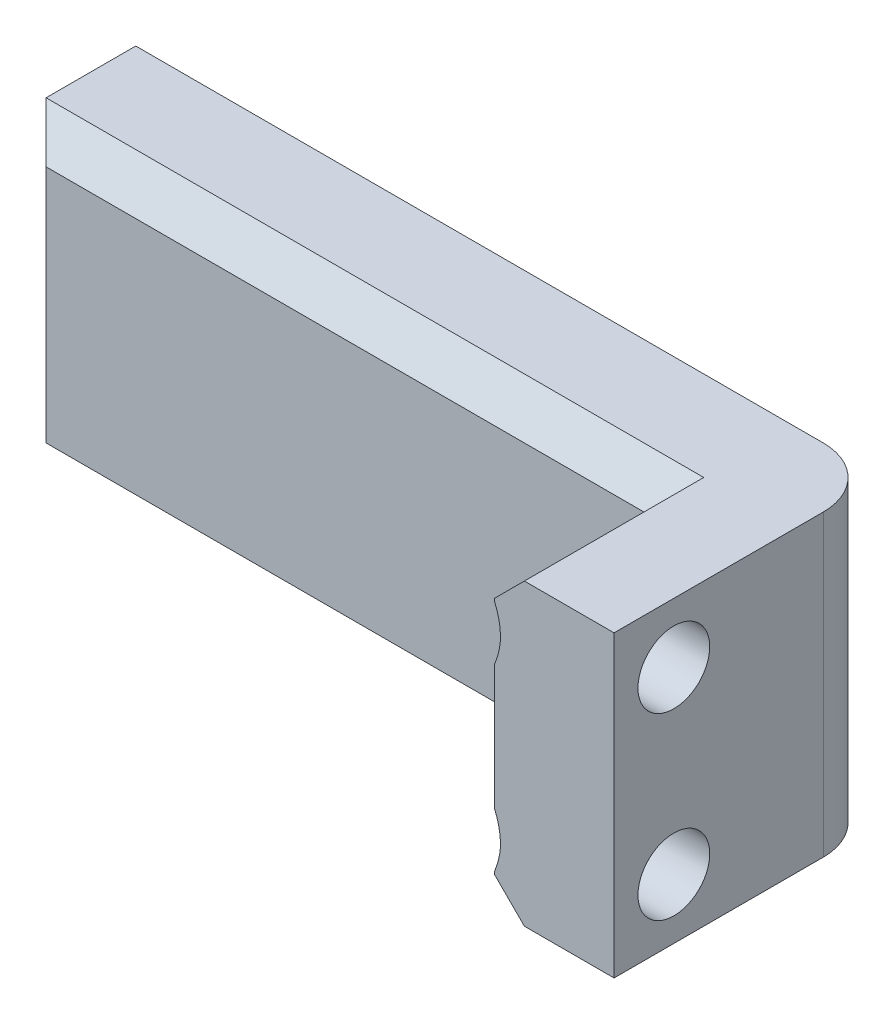
ISO-10303-21;
HEADER;
FILE_DESCRIPTION(('STEP AP214'),'2;1');
FILE_NAME('part.step','',(''),(''),'','','');
FILE_SCHEMA(('AUTOMOTIVE_DESIGN { 1 0 10303 214 1 1 1 1 }'));
ENDSEC;
DATA;
#1=APPLICATION_CONTEXT('core data for automotive mechanical design processes');
#2=APPLICATION_PROTOCOL_DEFINITION('international standard','automotive_design',2000,#1);
#3=PRODUCT_CONTEXT('',#1,'mechanical');
#4=PRODUCT('Part','Part','',(#3));
#5=PRODUCT_RELATED_PRODUCT_CATEGORY('part','',(#4));
#6=PRODUCT_DEFINITION_FORMATION('','',#4);
#7=PRODUCT_DEFINITION_CONTEXT('part definition',#1,'design');
#8=PRODUCT_DEFINITION('design','',#6,#7);
#9=PRODUCT_DEFINITION_SHAPE('','',#8);
#10=(LENGTH_UNIT() NAMED_UNIT(*) SI_UNIT(.MILLI.,.METRE.));
#11=(NAMED_UNIT(*) PLANE_ANGLE_UNIT() SI_UNIT($,.RADIAN.));
#12=(NAMED_UNIT(*) SI_UNIT($,.STERADIAN.) SOLID_ANGLE_UNIT());
#13=UNCERTAINTY_MEASURE_WITH_UNIT(LENGTH_MEASURE(1.E-05),#10,'distance_accuracy_value','');
#14=(GEOMETRIC_REPRESENTATION_CONTEXT(3) GLOBAL_UNCERTAINTY_ASSIGNED_CONTEXT((#13)) GLOBAL_UNIT_ASSIGNED_CONTEXT((#10,
#11,#12)) REPRESENTATION_CONTEXT('',''));
#15=CARTESIAN_POINT('',(0.,0.,0.));
#16=DIRECTION('',(0.,0.,1.));
#17=DIRECTION('',(1.,0.,0.));
#18=AXIS2_PLACEMENT_3D('',#15,#16,#17);
#19=CARTESIAN_POINT('',(21.,14.,9.));
#20=DIRECTION('',(1.,0.,0.));
#21=DIRECTION('',(0.,1.,0.));
#22=AXIS2_PLACEMENT_3D('',#19,#20,#21);
#23=PLANE('',#22);
#24=DIRECTION('',(0.,-1.,0.));
#25=VECTOR('',#24,1.);
#26=CARTESIAN_POINT('',(21.,14.,9.));
#27=LINE('',#26,#25);
#28=CARTESIAN_POINT('',(21.,11.,9.));
#29=VERTEX_POINT('',#28);
#30=CARTESIAN_POINT('',(21.,10.9165151389912,9.));
#31=VERTEX_POINT('',#30);
#32=EDGE_CURVE('E146',#29,#31,#27,.T.);
#33=ORIENTED_EDGE('',*,*,#32,.F.);
#34=DIRECTION('',(0.,0.,1.));
#35=VECTOR('',#34,1.);
#36=CARTESIAN_POINT('',(21.,11.,9.));
#37=LINE('',#36,#35);
#38=CARTESIAN_POINT('',(21.,11.,8.95959179422654));
#39=VERTEX_POINT('',#38);
#40=EDGE_CURVE('E174',#29,#39,#37,.F.);
#41=ORIENTED_EDGE('',*,*,#40,.T.);
#42=CARTESIAN_POINT('',(21.,10.,7.));
#43=DIRECTION('',(-1.,0.,0.));
#44=DIRECTION('',(0.,0.,1.));
#45=AXIS2_PLACEMENT_3D('',#42,#43,#44);
#46=CIRCLE('',#45,2.2);
#47=EDGE_CURVE('E166',#31,#39,#46,.T.);
#48=ORIENTED_EDGE('',*,*,#47,.F.);
#49=EDGE_LOOP('',(#33,#41,#48));
#50=FACE_BOUND('',#49,.T.);
#51=ADVANCED_FACE('F41',(#50),#23,.F.);
#52=DIRECTION('',(0.,-1.,0.));
#53=VECTOR('',#52,1.);
#54=CARTESIAN_POINT('',(21.,14.,4.));
#55=LINE('',#54,#53);
#56=CARTESIAN_POINT('',(21.,11.,4.));
#57=VERTEX_POINT('',#56);
#58=CARTESIAN_POINT('',(21.,3.,4.));
#59=VERTEX_POINT('',#58);
#60=EDGE_CURVE('E385',#57,#59,#55,.T.);
#61=ORIENTED_EDGE('',*,*,#60,.T.);
#62=DIRECTION('',(0.,0.,1.));
#63=VECTOR('',#62,1.);
#64=CARTESIAN_POINT('',(21.,3.,9.));
#65=LINE('',#64,#63);
#66=CARTESIAN_POINT('',(21.,3.00000000000001,5.04040820577346));
#67=VERTEX_POINT('',#66);
#68=EDGE_CURVE('E304',#59,#67,#65,.T.);
#69=ORIENTED_EDGE('',*,*,#68,.T.);
#70=CARTESIAN_POINT('',(21.,4.,7.));
#71=DIRECTION('',(-1.,0.,0.));
#72=DIRECTION('',(0.,0.,1.));
#73=AXIS2_PLACEMENT_3D('',#70,#71,#72);
#74=CIRCLE('',#73,2.2);
#75=CARTESIAN_POINT('',(21.,4.91651513899117,9.));
#76=VERTEX_POINT('',#75);
#77=EDGE_CURVE('E184',#76,#67,#74,.T.);
#78=ORIENTED_EDGE('',*,*,#77,.F.);
#79=CARTESIAN_POINT('',(21.,9.08348486100882,9.));
#80=VERTEX_POINT('',#79);
#81=EDGE_CURVE('E160',#80,#76,#27,.T.);
#82=ORIENTED_EDGE('',*,*,#81,.F.);
#83=CARTESIAN_POINT('',(21.,11.,5.04040820577346));
#84=VERTEX_POINT('',#83);
#85=EDGE_CURVE('E169',#84,#80,#46,.T.);
#86=ORIENTED_EDGE('',*,*,#85,.F.);
#87=DIRECTION('',(0.,0.,-1.));
#88=VECTOR('',#87,1.);
#89=CARTESIAN_POINT('',(21.,11.,9.));
#90=LINE('',#89,#88);
#91=EDGE_CURVE('E273',#84,#57,#90,.T.);
#92=ORIENTED_EDGE('',*,*,#91,.T.);
#93=EDGE_LOOP('',(#61,#69,#78,#82,#86,#92));
#94=FACE_BOUND('',#93,.T.);
#95=ADVANCED_FACE('F217',(#94),#23,.F.);
#96=CARTESIAN_POINT('',(21.,3.00000000000001,8.95959179422655));
#97=VERTEX_POINT('',#96);
#98=CARTESIAN_POINT('',(21.,3.08348486100883,9.));
#99=VERTEX_POINT('',#98);
#100=EDGE_CURVE('E189',#97,#99,#74,.T.);
#101=ORIENTED_EDGE('',*,*,#100,.F.);
#102=DIRECTION('',(0.,0.,-1.));
#103=VECTOR('',#102,1.);
#104=CARTESIAN_POINT('',(21.,3.,9.));
#105=LINE('',#104,#103);
#106=CARTESIAN_POINT('',(21.,3.,9.));
#107=VERTEX_POINT('',#106);
#108=EDGE_CURVE('E293',#97,#107,#105,.F.);
#109=ORIENTED_EDGE('',*,*,#108,.T.);
#110=EDGE_CURVE('E162',#99,#107,#27,.T.);
#111=ORIENTED_EDGE('',*,*,#110,.F.);
#112=EDGE_LOOP('',(#101,#109,#111));
#113=FACE_BOUND('',#112,.T.);
#114=ADVANCED_FACE('F336',(#113),#23,.F.);
#115=CARTESIAN_POINT('',(25.,0.,4.));
#116=DIRECTION('',(-1.,0.,0.));
#117=DIRECTION('',(0.,0.,1.));
#118=AXIS2_PLACEMENT_3D('',#115,#116,#117);
#119=PLANE('',#118);
#120=CARTESIAN_POINT('',(25.,10.,7.));
#121=DIRECTION('',(-1.,0.,0.));
#122=DIRECTION('',(0.,0.,1.));
#123=AXIS2_PLACEMENT_3D('',#120,#121,#122);
#124=CIRCLE('',#123,1.2);
#125=CARTESIAN_POINT('',(25.,10.,8.2));
#126=VERTEX_POINT('',#125);
#127=EDGE_CURVE('E181',#126,#126,#124,.T.);
#128=ORIENTED_EDGE('',*,*,#127,.T.);
#129=EDGE_LOOP('',(#128));
#130=FACE_BOUND('',#129,.T.);
#131=CARTESIAN_POINT('',(25.,4.,7.));
#132=DIRECTION('',(-1.,0.,0.));
#133=DIRECTION('',(0.,0.,1.));
#134=AXIS2_PLACEMENT_3D('',#131,#132,#133);
#135=CIRCLE('',#134,1.2);
#136=CARTESIAN_POINT('',(25.,4.,8.2));
#137=VERTEX_POINT('',#136);
#138=EDGE_CURVE('E203',#137,#137,#135,.T.);
#139=ORIENTED_EDGE('',*,*,#138,.T.);
#140=EDGE_LOOP('',(#139));
#141=FACE_BOUND('',#140,.T.);
#142=DIRECTION('',(0.,0.,1.));
#143=VECTOR('',#142,1.);
#144=CARTESIAN_POINT('',(25.,2.,0.));
#145=LINE('',#144,#143);
#146=CARTESIAN_POINT('',(25.,2.,2.));
#147=VERTEX_POINT('',#146);
#148=CARTESIAN_POINT('',(25.,2.,9.));
#149=VERTEX_POINT('',#148);
#150=EDGE_CURVE('E367',#147,#149,#145,.T.);
#151=ORIENTED_EDGE('',*,*,#150,.F.);
#152=DIRECTION('',(0.,1.,0.));
#153=VECTOR('',#152,1.);
#154=CARTESIAN_POINT('',(25.,0.,2.));
#155=LINE('',#154,#153);
#156=CARTESIAN_POINT('',(25.,12.,2.));
#157=VERTEX_POINT('',#156);
#158=EDGE_CURVE('E171',#147,#157,#155,.T.);
#159=ORIENTED_EDGE('',*,*,#158,.T.);
#160=DIRECTION('',(0.,0.,1.));
#161=VECTOR('',#160,1.);
#162=CARTESIAN_POINT('',(25.,12.,0.));
#163=LINE('',#162,#161);
#164=CARTESIAN_POINT('',(25.,12.,9.));
#165=VERTEX_POINT('',#164);
#166=EDGE_CURVE('E390',#157,#165,#163,.T.);
#167=ORIENTED_EDGE('',*,*,#166,.T.);
#168=DIRECTION('',(0.,1.,0.));
#169=VECTOR('',#168,1.);
#170=CARTESIAN_POINT('',(25.,14.,9.));
#171=LINE('',#170,#169);
#172=EDGE_CURVE('E383',#149,#165,#171,.T.);
#173=ORIENTED_EDGE('',*,*,#172,.F.);
#174=EDGE_LOOP('',(#151,#159,#167,#173));
#175=FACE_BOUND('',#174,.T.);
#176=ADVANCED_FACE('F342',(#130,#141,#175),#119,.F.);
#177=CARTESIAN_POINT('',(0.,0.,4.));
#178=DIRECTION('',(-1.,0.,0.));
#179=DIRECTION('',(0.,0.,1.));
#180=AXIS2_PLACEMENT_3D('',#177,#178,#179);
#181=PLANE('',#180);
#182=DIRECTION('',(0.,0.,1.));
#183=VECTOR('',#182,1.);
#184=CARTESIAN_POINT('',(0.,2.,0.));
#185=LINE('',#184,#183);
#186=CARTESIAN_POINT('',(0.,2.,0.));
#187=VERTEX_POINT('',#186);
#188=CARTESIAN_POINT('',(0.,2.,3.));
#189=VERTEX_POINT('',#188);
#190=EDGE_CURVE('E377',#187,#189,#185,.T.);
#191=ORIENTED_EDGE('',*,*,#190,.T.);
#192=DIRECTION('',(0.,1.,0.));
#193=VECTOR('',#192,1.);
#194=CARTESIAN_POINT('',(0.,0.,3.));
#195=LINE('',#194,#193);
#196=CARTESIAN_POINT('',(0.,12.,3.));
#197=VERTEX_POINT('',#196);
#198=EDGE_CURVE('E11',#189,#197,#195,.T.);
#199=ORIENTED_EDGE('',*,*,#198,.T.);
#200=DIRECTION('',(0.,0.,1.));
#201=VECTOR('',#200,1.);
#202=CARTESIAN_POINT('',(0.,12.,0.));
#203=LINE('',#202,#201);
#204=CARTESIAN_POINT('',(0.,12.,0.));
#205=VERTEX_POINT('',#204);
#206=EDGE_CURVE('E401',#205,#197,#203,.T.);
#207=ORIENTED_EDGE('',*,*,#206,.F.);
#208=DIRECTION('',(0.,1.,0.));
#209=VECTOR('',#208,1.);
#210=CARTESIAN_POINT('',(0.,0.,0.));
#211=LINE('',#210,#209);
#212=EDGE_CURVE('E159',#187,#205,#211,.T.);
#213=ORIENTED_EDGE('',*,*,#212,.F.);
#214=EDGE_LOOP('',(#191,#199,#207,#213));
#215=FACE_BOUND('',#214,.T.);
#216=ADVANCED_FACE('F347',(#215),#181,.T.);
#217=CARTESIAN_POINT('',(0.,0.,4.));
#218=DIRECTION('',(0.,0.,1.));
#219=DIRECTION('',(1.,0.,0.));
#220=AXIS2_PLACEMENT_3D('',#217,#218,#219);
#221=PLANE('',#220);
#222=DIRECTION('',(0.,-1.,0.));
#223=VECTOR('',#222,1.);
#224=CARTESIAN_POINT('',(1.,0.,4.));
#225=LINE('',#224,#223);
#226=CARTESIAN_POINT('',(1.,11.,4.));
#227=VERTEX_POINT('',#226);
#228=CARTESIAN_POINT('',(1.,3.,4.));
#229=VERTEX_POINT('',#228);
#230=EDGE_CURVE('E61',#227,#229,#225,.T.);
#231=ORIENTED_EDGE('',*,*,#230,.T.);
#232=DIRECTION('',(1.,0.,0.));
#233=VECTOR('',#232,1.);
#234=CARTESIAN_POINT('',(21.,3.,4.));
#235=LINE('',#234,#233);
#236=EDGE_CURVE('E53',#229,#59,#235,.T.);
#237=ORIENTED_EDGE('',*,*,#236,.T.);
#238=ORIENTED_EDGE('',*,*,#60,.F.);
#239=DIRECTION('',(-1.,0.,0.));
#240=VECTOR('',#239,1.);
#241=CARTESIAN_POINT('',(0.,11.,4.));
#242=LINE('',#241,#240);
#243=EDGE_CURVE('E66',#57,#227,#242,.T.);
#244=ORIENTED_EDGE('',*,*,#243,.T.);
#245=EDGE_LOOP('',(#231,#237,#238,#244));
#246=FACE_BOUND('',#245,.T.);
#247=ADVANCED_FACE('F460',(#246),#221,.T.);
#248=CARTESIAN_POINT('',(0.,0.,0.));
#249=DIRECTION('',(0.,0.,1.));
#250=DIRECTION('',(1.,0.,0.));
#251=AXIS2_PLACEMENT_3D('',#248,#249,#250);
#252=PLANE('',#251);
#253=DIRECTION('',(1.,0.,0.));
#254=VECTOR('',#253,1.);
#255=CARTESIAN_POINT('',(25.,12.,0.));
#256=LINE('',#255,#254);
#257=CARTESIAN_POINT('',(23.,12.,0.));
#258=VERTEX_POINT('',#257);
#259=EDGE_CURVE('E204',#205,#258,#256,.T.);
#260=ORIENTED_EDGE('',*,*,#259,.T.);
#261=DIRECTION('',(0.,1.,0.));
#262=VECTOR('',#261,1.);
#263=CARTESIAN_POINT('',(23.,0.,0.));
#264=LINE('',#263,#262);
#265=CARTESIAN_POINT('',(23.,2.,0.));
#266=VERTEX_POINT('',#265);
#267=EDGE_CURVE('E408',#258,#266,#264,.F.);
#268=ORIENTED_EDGE('',*,*,#267,.T.);
#269=DIRECTION('',(-1.,0.,0.));
#270=VECTOR('',#269,1.);
#271=CARTESIAN_POINT('',(0.,2.,0.));
#272=LINE('',#271,#270);
#273=EDGE_CURVE('E369',#266,#187,#272,.T.);
#274=ORIENTED_EDGE('',*,*,#273,.T.);
#275=ORIENTED_EDGE('',*,*,#212,.T.);
#276=EDGE_LOOP('',(#260,#268,#274,#275));
#277=FACE_BOUND('',#276,.T.);
#278=ADVANCED_FACE('F215',(#277),#252,.F.);
#279=CARTESIAN_POINT('',(0.,0.,9.));
#280=DIRECTION('',(0.,0.,-1.));
#281=DIRECTION('',(-1.,0.,0.));
#282=AXIS2_PLACEMENT_3D('',#279,#280,#281);
#283=PLANE('',#282);
#284=ORIENTED_EDGE('',*,*,#110,.T.);
#285=DIRECTION('',(-0.707106781186546,0.707106781186549,0.));
#286=VECTOR('',#285,1.);
#287=CARTESIAN_POINT('',(21.,3.,9.));
#288=LINE('',#287,#286);
#289=CARTESIAN_POINT('',(22.,2.,9.));
#290=VERTEX_POINT('',#289);
#291=EDGE_CURVE('E288',#107,#290,#288,.F.);
#292=ORIENTED_EDGE('',*,*,#291,.T.);
#293=DIRECTION('',(-1.,0.,0.));
#294=VECTOR('',#293,1.);
#295=CARTESIAN_POINT('',(0.,2.,9.));
#296=LINE('',#295,#294);
#297=EDGE_CURVE('E362',#149,#290,#296,.T.);
#298=ORIENTED_EDGE('',*,*,#297,.F.);
#299=ORIENTED_EDGE('',*,*,#172,.T.);
#300=DIRECTION('',(-1.,0.,0.));
#301=VECTOR('',#300,1.);
#302=CARTESIAN_POINT('',(0.,12.,9.));
#303=LINE('',#302,#301);
#304=CARTESIAN_POINT('',(22.,12.,9.));
#305=VERTEX_POINT('',#304);
#306=EDGE_CURVE('E172',#165,#305,#303,.T.);
#307=ORIENTED_EDGE('',*,*,#306,.T.);
#308=DIRECTION('',(0.707106781186549,0.707106781186546,0.));
#309=VECTOR('',#308,1.);
#310=CARTESIAN_POINT('',(21.,11.,9.));
#311=LINE('',#310,#309);
#312=EDGE_CURVE('E154',#305,#29,#311,.F.);
#313=ORIENTED_EDGE('',*,*,#312,.T.);
#314=ORIENTED_EDGE('',*,*,#32,.T.);
#315=CARTESIAN_POINT('',(15.7056820158598,2.77747952253452,9.));
#316=CARTESIAN_POINT('',(15.8827708741713,2.96124941855785,9.));
#317=CARTESIAN_POINT('',(16.0596267472348,3.14524495219191,9.));
#318=CARTESIAN_POINT('',(16.4127156852304,3.51385382898863,9.));
#319=CARTESIAN_POINT('',(16.588948711791,3.69846720889633,9.));
#320=CARTESIAN_POINT('',(16.9411323410438,4.06900183167142,9.));
#321=CARTESIAN_POINT('',(17.1170805768509,4.25492532614765,9.));
#322=CARTESIAN_POINT('',(17.467905136437,4.62776553018345,9.));
#323=CARTESIAN_POINT('',(17.6427815103275,4.81468219253604,9.));
#324=CARTESIAN_POINT('',(18.01252403808,5.21292914281576,9.));
#325=CARTESIAN_POINT('',(18.2072025765722,5.42443383233297,9.));
#326=CARTESIAN_POINT('',(18.5939622963415,5.84987789548364,9.));
#327=CARTESIAN_POINT('',(18.7860430655762,6.06381764566679,9.));
#328=CARTESIAN_POINT('',(19.0709206914848,6.38726433513205,9.));
#329=CARTESIAN_POINT('',(19.1652612341455,6.49541061368305,9.));
#330=CARTESIAN_POINT('',(19.3526182688895,6.71284266485993,9.));
#331=CARTESIAN_POINT('',(19.4456347899726,6.82212841243719,9.));
#332=CARTESIAN_POINT('',(19.6299211772655,7.04211732345765,9.));
#333=CARTESIAN_POINT('',(19.7211914914489,7.15282011087114,9.));
#334=CARTESIAN_POINT('',(19.9014265715123,7.37608256591183,9.));
#335=CARTESIAN_POINT('',(19.9903915315966,7.48864207581184,9.));
#336=CARTESIAN_POINT('',(20.1280385005135,7.66789889984139,9.));
#337=CARTESIAN_POINT('',(20.1777862376504,7.73377740847841,9.));
#338=CARTESIAN_POINT('',(20.2759892062619,7.86649686453955,9.));
#339=CARTESIAN_POINT('',(20.3244443969477,7.93333784223403,9.));
#340=CARTESIAN_POINT('',(20.4198315472161,8.06826065185596,9.));
#341=CARTESIAN_POINT('',(20.4667609701499,8.13634428298424,9.));
#342=CARTESIAN_POINT('',(20.55860851882,8.27385723653465,9.));
#343=CARTESIAN_POINT('',(20.6035267236585,8.34328650587801,9.));
#344=CARTESIAN_POINT('',(20.6900268342181,8.48247402345667,9.));
#345=CARTESIAN_POINT('',(20.731654255941,8.55220382846248,9.));
#346=CARTESIAN_POINT('',(20.8117747283708,8.69347555992563,9.));
#347=CARTESIAN_POINT('',(20.8502671052407,8.76501787164809,9.));
#348=CARTESIAN_POINT('',(20.9231024196597,8.90996393940157,9.));
#349=CARTESIAN_POINT('',(20.9574561748058,8.98336220796095,9.));
#350=CARTESIAN_POINT('',(21.0209536933234,9.13237154219578,9.));
#351=CARTESIAN_POINT('',(21.0501001728661,9.20798143017336,9.));
#352=CARTESIAN_POINT('',(21.0965355232777,9.34587735789981,9.));
#353=CARTESIAN_POINT('',(21.1150303882153,9.40775435900184,9.));
#354=CARTESIAN_POINT('',(21.1470447840559,9.5328015030545,9.));
#355=CARTESIAN_POINT('',(21.1605644106354,9.5959716211131,9.));
#356=CARTESIAN_POINT('',(21.1818635223296,9.72293276480231,9.));
#357=CARTESIAN_POINT('',(21.1896739479996,9.78671851650701,9.));
#358=CARTESIAN_POINT('',(21.1992011861943,9.91474724824546,9.));
#359=CARTESIAN_POINT('',(21.2009185044503,9.97899018988869,9.));
#360=CARTESIAN_POINT('',(21.1981830249889,10.1058085405663,9.));
#361=CARTESIAN_POINT('',(21.1938762939178,10.1683872035033,9.));
#362=CARTESIAN_POINT('',(21.1796144072077,10.2928905157534,9.));
#363=CARTESIAN_POINT('',(21.1696588947742,10.3548151235026,9.));
#364=CARTESIAN_POINT('',(21.1445725766063,10.4779541318376,9.));
#365=CARTESIAN_POINT('',(21.1294130343581,10.5391625947017,9.));
#366=CARTESIAN_POINT('',(21.0946244819242,10.6602800534279,9.));
#367=CARTESIAN_POINT('',(21.0749951658668,10.7201889600525,9.));
#368=CARTESIAN_POINT('',(21.0039558053671,10.9158710043263,9.));
#369=CARTESIAN_POINT('',(20.9444793694626,11.0487106618382,9.));
#370=CARTESIAN_POINT('',(20.8128814842662,11.3080028192574,9.));
#371=CARTESIAN_POINT('',(20.7407334644389,11.4344411642955,9.));
#372=CARTESIAN_POINT('',(20.6259532652224,11.6211509053209,9.));
#373=CARTESIAN_POINT('',(20.5863159844172,11.6832968475965,9.));
#374=CARTESIAN_POINT('',(20.5053414030205,11.8064741038339,9.));
#375=CARTESIAN_POINT('',(20.4640040558874,11.8675053872143,9.));
#376=CARTESIAN_POINT('',(20.3799977312867,11.9885439054988,9.));
#377=CARTESIAN_POINT('',(20.337330222137,12.0485521638351,9.));
#378=CARTESIAN_POINT('',(20.2508610112535,12.1677401816715,9.));
#379=CARTESIAN_POINT('',(20.2070593558574,12.2269199748685,9.));
#380=CARTESIAN_POINT('',(20.0538092598364,12.4305692624566,9.));
#381=CARTESIAN_POINT('',(19.9419949913899,12.5732582225636,9.));
#382=CARTESIAN_POINT('',(19.7146392278638,12.8556442494943,9.));
#383=CARTESIAN_POINT('',(19.5990970732234,12.9953407795229,9.));
#384=CARTESIAN_POINT('',(19.3653639825318,13.2726125856265,9.));
#385=CARTESIAN_POINT('',(19.2471717684677,13.410186781751,9.));
#386=CARTESIAN_POINT('',(19.0089147594242,13.6837068347325,9.));
#387=CARTESIAN_POINT('',(18.888849900238,13.8196526354734,9.));
#388=CARTESIAN_POINT('',(18.6470537019693,14.0906068394231,9.));
#389=CARTESIAN_POINT('',(18.5253191989872,14.2256124146784,9.));
#390=CARTESIAN_POINT('',(18.2807779424554,14.4946497407475,9.));
#391=CARTESIAN_POINT('',(18.1579711789678,14.6286814825145,9.));
#392=CARTESIAN_POINT('',(17.7883868504378,15.0295475921749,9.));
#393=CARTESIAN_POINT('',(17.5403688669579,15.2952377767201,9.));
#394=CARTESIAN_POINT('',(17.0728254701256,15.79209429051,9.));
#395=CARTESIAN_POINT('',(16.8535439746989,16.0234909920675,9.));
#396=CARTESIAN_POINT('',(16.4137860544681,16.4851868184844,9.));
#397=CARTESIAN_POINT('',(16.1933095206874,16.7154858395201,9.));
#398=CARTESIAN_POINT('',(15.7523777285263,17.1743362290311,9.));
#399=CARTESIAN_POINT('',(15.5319259067835,17.4028909036499,9.));
#400=CARTESIAN_POINT('',(15.0903826084694,17.8593352974949,9.));
#401=CARTESIAN_POINT('',(14.8692912014463,18.0872250839803,9.));
#402=CARTESIAN_POINT('',(14.6479643786143,18.3148850424675,9.));
#403=B_SPLINE_CURVE_WITH_KNOTS('',3,(#315,#316,#317,#318,#319,#320,#321,#322,#323,#324,#325,
#326,#327,#328,#329,#330,#331,#332,#333,#334,#335,#336,#337,#338,#339,#340,#341,#342,#343,#344,
#345,#346,#347,#348,#349,#350,#351,#352,#353,#354,#355,#356,#357,#358,#359,#360,#361,#362,#363,
#364,#365,#366,#367,#368,#369,#370,#371,#372,#373,#374,#375,#376,#377,#378,#379,#380,#381,#382,
#383,#384,#385,#386,#387,#388,#389,#390,#391,#392,#393,#394,#395,#396,#397,#398,#399,#400,#401,
#402),.UNSPECIFIED.,.F.,.F.,(4,2,2,2,2,2,2,2,2,2,2,2,2,2,2,2,2,2,2,2,2,2,2,2,2,2,2,2,2,2,2,2,2,
2,2,2,2,2,2,2,2,2,2,4),(0.,0.765629215709926,1.53130480473901,2.29923917549722,3.06713736583846,
3.92950882383997,4.79201549852738,5.22254439423846,5.65306384562668,6.08347132870711,
6.51384243538902,6.7614858938828,7.00913715803204,7.25718103763089,7.50521515296011,
7.74878232858567,7.99240171839592,8.23536984124434,8.4782108569125,8.67178350759992,
8.86535243558207,9.05786439329668,9.25036037204169,9.43826891885465,9.62618933587947,
9.81516459654674,10.0041527928953,10.4395589623151,10.8758892615192,11.0969965632642,
11.3181099221492,11.5389872898052,11.7598556472991,12.3035846656902,12.8474104172984,
13.3915043278051,13.9356169347116,14.4809645183917,15.0263171618726,16.1166798005134,
17.073054016216,18.0295169631377,18.9821572900799,19.9346976536075),.UNSPECIFIED.);
#404=EDGE_CURVE('E150',#31,#80,#403,.F.);
#405=ORIENTED_EDGE('',*,*,#404,.T.);
#406=ORIENTED_EDGE('',*,*,#81,.T.);
#407=CARTESIAN_POINT('',(16.4211986144426,-2.4770478016482,9.));
#408=CARTESIAN_POINT('',(16.5700552203041,-2.32124220339834,9.));
#409=CARTESIAN_POINT('',(16.7186813475051,-2.16521532744484,9.));
#410=CARTESIAN_POINT('',(17.0153295766961,-1.85257478868484,9.));
#411=CARTESIAN_POINT('',(17.1633516502184,-1.69596109887537,9.));
#412=CARTESIAN_POINT('',(17.4590173115574,-1.38161051467634,9.));
#413=CARTESIAN_POINT('',(17.6066589252506,-1.22387176152259,9.));
#414=CARTESIAN_POINT('',(17.9009473365671,-0.907477672200558,9.));
#415=CARTESIAN_POINT('',(18.047594165569,-0.748822365238274,9.));
#416=CARTESIAN_POINT('',(18.3566322917281,-0.411720649064006,9.));
#417=CARTESIAN_POINT('',(18.5188626944319,-0.233126359836852,9.));
#418=CARTESIAN_POINT('',(18.8410480729642,0.12614089451467,9.));
#419=CARTESIAN_POINT('',(19.0010028033181,0.306814080142269,9.));
#420=CARTESIAN_POINT('',(19.3173119163294,0.670819029440191,9.));
#421=CARTESIAN_POINT('',(19.4736714764898,0.854146257668853,9.));
#422=CARTESIAN_POINT('',(19.7042302802769,1.13241187531238,9.));
#423=CARTESIAN_POINT('',(19.7804134443304,1.22570475515016,9.));
#424=CARTESIAN_POINT('',(19.9310620772194,1.41366471312458,9.));
#425=CARTESIAN_POINT('',(20.0055276401285,1.50833171553517,9.));
#426=CARTESIAN_POINT('',(20.1312506574589,1.67209801997372,9.));
#427=CARTESIAN_POINT('',(20.1830595238304,1.74077349512464,9.));
#428=CARTESIAN_POINT('',(20.285260056782,1.87917712178183,9.));
#429=CARTESIAN_POINT('',(20.3356516805327,1.94890530500367,9.));
#430=CARTESIAN_POINT('',(20.4347644719002,2.08975472895261,9.));
#431=CARTESIAN_POINT('',(20.4834820711288,2.1608784922831,9.));
#432=CARTESIAN_POINT('',(20.5786612623434,2.30461817731721,9.));
#433=CARTESIAN_POINT('',(20.6251229655142,2.3772340252299,9.));
#434=CARTESIAN_POINT('',(20.7141554973609,2.52262014522773,9.));
#435=CARTESIAN_POINT('',(20.7567900128402,2.59535081539366,9.));
#436=CARTESIAN_POINT('',(20.8384718894249,2.74278739444862,9.));
#437=CARTESIAN_POINT('',(20.8775182741137,2.81749383391147,9.));
#438=CARTESIAN_POINT('',(20.9874599119722,3.04456736387353,9.));
#439=CARTESIAN_POINT('',(21.0515867198197,3.20055317893102,9.));
#440=CARTESIAN_POINT('',(21.115558052239,3.4108245791012,9.));
#441=CARTESIAN_POINT('',(21.129214870816,3.46096359720624,9.));
#442=CARTESIAN_POINT('',(21.1532007731904,3.56205076842096,9.));
#443=CARTESIAN_POINT('',(21.1635294416279,3.61299902169295,9.));
#444=CARTESIAN_POINT('',(21.1804791302816,3.71538614010085,9.));
#445=CARTESIAN_POINT('',(21.1871091698893,3.76682349789621,9.));
#446=CARTESIAN_POINT('',(21.196442327738,3.87005314538187,9.));
#447=CARTESIAN_POINT('',(21.199145632425,3.92184541810306,9.));
#448=CARTESIAN_POINT('',(21.2006418086285,4.03569581703505,9.));
#449=CARTESIAN_POINT('',(21.198559973358,4.09776745302075,9.));
#450=CARTESIAN_POINT('',(21.1887221529281,4.22145775799751,9.));
#451=CARTESIAN_POINT('',(21.1809652944904,4.28307635580045,9.));
#452=CARTESIAN_POINT('',(21.1601726895154,4.40566230897041,9.));
#453=CARTESIAN_POINT('',(21.1471155892009,4.46662599369491,9.));
#454=CARTESIAN_POINT('',(21.1163550703829,4.58735454923728,9.));
#455=CARTESIAN_POINT('',(21.0986512448155,4.64711931453303,9.));
#456=CARTESIAN_POINT('',(21.0377900525588,4.82992623615138,9.));
#457=CARTESIAN_POINT('',(20.9879589469082,4.95074729136749,9.));
#458=CARTESIAN_POINT('',(20.8766665778619,5.18692007953373,9.));
#459=CARTESIAN_POINT('',(20.8151842029508,5.30226140148202,9.));
#460=CARTESIAN_POINT('',(20.6835935450828,5.53004875043794,9.));
#461=CARTESIAN_POINT('',(20.6133751174914,5.64243035834486,9.));
#462=CARTESIAN_POINT('',(20.5040603503459,5.80825858307285,9.));
#463=CARTESIAN_POINT('',(20.4669729086706,5.86305632724423,9.));
#464=CARTESIAN_POINT('',(20.3916688409552,5.97186886900697,9.));
#465=CARTESIAN_POINT('',(20.3534522607875,6.02588369827262,9.));
#466=CARTESIAN_POINT('',(20.2254737415079,6.20345529374713,9.));
#467=CARTESIAN_POINT('',(20.1336823296913,6.32554831303686,9.));
#468=CARTESIAN_POINT('',(19.946672928229,6.56709000020943,9.));
#469=CARTESIAN_POINT('',(19.8514543178991,6.68653818270674,9.));
#470=CARTESIAN_POINT('',(19.6585157304037,6.92349860291955,9.));
#471=CARTESIAN_POINT('',(19.5607944306993,7.04100976076688,9.));
#472=CARTESIAN_POINT('',(19.3635345754436,7.27449946714184,9.));
#473=CARTESIAN_POINT('',(19.2639959468602,7.39047795375247,9.));
#474=CARTESIAN_POINT('',(18.9628434956418,7.73721258832479,9.));
#475=CARTESIAN_POINT('',(18.7591769683939,7.96618350807307,9.));
#476=CARTESIAN_POINT('',(18.3485959790924,8.421037944201,9.));
#477=CARTESIAN_POINT('',(18.1416825973003,8.64692244255762,9.));
#478=CARTESIAN_POINT('',(17.7509003838577,9.06934871028727,9.));
#479=CARTESIAN_POINT('',(17.5672833257255,9.26612370332123,9.));
#480=CARTESIAN_POINT('',(17.1987963354612,9.65853200984849,9.));
#481=CARTESIAN_POINT('',(17.0139262813478,9.85416520863299,9.));
#482=CARTESIAN_POINT('',(16.6441254041792,10.243654711241,9.));
#483=CARTESIAN_POINT('',(16.4591988250285,10.4375150483285,9.));
#484=CARTESIAN_POINT('',(16.0886563799095,10.8245328874184,9.));
#485=CARTESIAN_POINT('',(15.9030405965752,11.0176904685104,9.));
#486=CARTESIAN_POINT('',(15.7171691861677,11.2106003209468,9.));
#487=B_SPLINE_CURVE_WITH_KNOTS('',3,(#407,#408,#409,#410,#411,#412,#413,#414,#415,#416,#417,
#418,#419,#420,#421,#422,#423,#424,#425,#426,#427,#428,#429,#430,#431,#432,#433,#434,#435,#436,
#437,#438,#439,#440,#441,#442,#443,#444,#445,#446,#447,#448,#449,#450,#451,#452,#453,#454,#455,
#456,#457,#458,#459,#460,#461,#462,#463,#464,#465,#466,#467,#468,#469,#470,#471,#472,#473,#474,
#475,#476,#477,#478,#479,#480,#481,#482,#483,#484,#485,#486),.UNSPECIFIED.,.F.,.F.,(4,2,2,2,2,2,
2,2,2,2,2,2,2,2,2,2,2,2,2,2,2,2,2,2,2,2,2,2,2,2,2,2,2,2,2,2,2,2,2,4),(0.,0.646455138333116,
1.29294039868376,1.94110056298845,2.58924018635008,3.31305649937243,4.03695030672679,
4.7597264481824,5.12105269602147,5.48235910669294,5.74042288671485,5.99849445715377,
6.257085741216,6.51566426729968,6.76847290203452,7.02135012960213,7.52473960513553,
7.6805472357285,7.8363743039132,7.99181969586296,8.14725770683907,8.33329947590921,
8.51936987929916,8.70619748913923,8.89304147097919,9.28406534799813,9.67580463496394,
10.0731096974352,10.271606500871,10.4700952512086,10.9282420606243,11.386472264577,
11.8449498300436,12.303445860859,13.2227133814105,14.141681277826,14.9490898252849,
15.7565781378997,16.5603280058329,17.3639844319384),.UNSPECIFIED.);
#488=EDGE_CURVE('E193',#76,#99,#487,.F.);
#489=ORIENTED_EDGE('',*,*,#488,.T.);
#490=EDGE_LOOP('',(#284,#292,#298,#299,#307,#313,#314,#405,#406,#489));
#491=FACE_BOUND('',#490,.T.);
#492=ADVANCED_FACE('F149',(#491),#283,.F.);
#493=CARTESIAN_POINT('',(0.,2.,0.));
#494=DIRECTION('',(0.,1.,0.));
#495=DIRECTION('',(-1.,0.,0.));
#496=AXIS2_PLACEMENT_3D('',#493,#494,#495);
#497=PLANE('',#496);
#498=ORIENTED_EDGE('',*,*,#297,.T.);
#499=DIRECTION('',(0.,0.,-1.));
#500=VECTOR('',#499,1.);
#501=CARTESIAN_POINT('',(22.,2.,0.));
#502=LINE('',#501,#500);
#503=CARTESIAN_POINT('',(22.,2.,3.));
#504=VERTEX_POINT('',#503);
#505=EDGE_CURVE('E280',#290,#504,#502,.T.);
#506=ORIENTED_EDGE('',*,*,#505,.T.);
#507=DIRECTION('',(-1.,0.,0.));
#508=VECTOR('',#507,1.);
#509=CARTESIAN_POINT('',(0.,2.,3.));
#510=LINE('',#509,#508);
#511=EDGE_CURVE('E285',#504,#189,#510,.T.);
#512=ORIENTED_EDGE('',*,*,#511,.T.);
#513=ORIENTED_EDGE('',*,*,#190,.F.);
#514=ORIENTED_EDGE('',*,*,#273,.F.);
#515=CARTESIAN_POINT('',(23.,2.,2.));
#516=DIRECTION('',(0.,1.,0.));
#517=DIRECTION('',(-1.,0.,0.));
#518=AXIS2_PLACEMENT_3D('',#515,#516,#517);
#519=CIRCLE('',#518,2.);
#520=EDGE_CURVE('E414',#266,#147,#519,.F.);
#521=ORIENTED_EDGE('',*,*,#520,.T.);
#522=ORIENTED_EDGE('',*,*,#150,.T.);
#523=EDGE_LOOP('',(#498,#506,#512,#513,#514,#521,#522));
#524=FACE_BOUND('',#523,.T.);
#525=ADVANCED_FACE('F214',(#524),#497,.F.);
#526=CARTESIAN_POINT('',(25.,12.,0.));
#527=DIRECTION('',(0.,-1.,0.));
#528=DIRECTION('',(1.,0.,0.));
#529=AXIS2_PLACEMENT_3D('',#526,#527,#528);
#530=PLANE('',#529);
#531=DIRECTION('',(1.,0.,0.));
#532=VECTOR('',#531,1.);
#533=CARTESIAN_POINT('',(21.,12.,3.));
#534=LINE('',#533,#532);
#535=CARTESIAN_POINT('',(22.,12.,3.));
#536=VERTEX_POINT('',#535);
#537=EDGE_CURVE('E269',#197,#536,#534,.T.);
#538=ORIENTED_EDGE('',*,*,#537,.T.);
#539=DIRECTION('',(0.,0.,1.));
#540=VECTOR('',#539,1.);
#541=CARTESIAN_POINT('',(22.,12.,0.));
#542=LINE('',#541,#540);
#543=EDGE_CURVE('E274',#536,#305,#542,.T.);
#544=ORIENTED_EDGE('',*,*,#543,.T.);
#545=ORIENTED_EDGE('',*,*,#306,.F.);
#546=ORIENTED_EDGE('',*,*,#166,.F.);
#547=CARTESIAN_POINT('',(23.,12.,2.));
#548=DIRECTION('',(0.,-1.,0.));
#549=DIRECTION('',(1.,0.,0.));
#550=AXIS2_PLACEMENT_3D('',#547,#548,#549);
#551=CIRCLE('',#550,2.);
#552=EDGE_CURVE('E396',#157,#258,#551,.F.);
#553=ORIENTED_EDGE('',*,*,#552,.T.);
#554=ORIENTED_EDGE('',*,*,#259,.F.);
#555=ORIENTED_EDGE('',*,*,#206,.T.);
#556=EDGE_LOOP('',(#538,#544,#545,#546,#553,#554,#555));
#557=FACE_BOUND('',#556,.T.);
#558=ADVANCED_FACE('F395',(#557),#530,.F.);
#559=CARTESIAN_POINT('',(21.,4.,7.));
#560=DIRECTION('',(-1.,0.,0.));
#561=DIRECTION('',(0.,0.,1.));
#562=AXIS2_PLACEMENT_3D('',#559,#560,#561);
#563=CYLINDRICAL_SURFACE('',#562,1.2);
#564=CARTESIAN_POINT('',(22.,4.,7.));
#565=DIRECTION('',(-1.,0.,0.));
#566=DIRECTION('',(0.,0.,1.));
#567=AXIS2_PLACEMENT_3D('',#564,#565,#566);
#568=CIRCLE('',#567,1.2);
#569=CARTESIAN_POINT('',(22.,4.,8.2));
#570=VERTEX_POINT('',#569);
#571=EDGE_CURVE('E188',#570,#570,#568,.T.);
#572=ORIENTED_EDGE('',*,*,#571,.T.);
#573=EDGE_LOOP('',(#572));
#574=FACE_BOUND('',#573,.T.);
#575=ORIENTED_EDGE('',*,*,#138,.F.);
#576=EDGE_LOOP('',(#575));
#577=FACE_BOUND('',#576,.T.);
#578=ADVANCED_FACE('F428',(#574,#577),#563,.F.);
#579=CARTESIAN_POINT('',(21.,4.,7.));
#580=DIRECTION('',(-1.,0.,0.));
#581=DIRECTION('',(0.,0.,1.));
#582=AXIS2_PLACEMENT_3D('',#579,#580,#581);
#583=CONICAL_SURFACE('',#582,2.2,0.785398163397449);
#584=ORIENTED_EDGE('',*,*,#571,.F.);
#585=EDGE_LOOP('',(#584));
#586=FACE_BOUND('',#585,.T.);
#587=ORIENTED_EDGE('',*,*,#77,.T.);
#588=CARTESIAN_POINT('',(21.,3.,5.04040820577345));
#589=CARTESIAN_POINT('',(21.0500485545534,2.94995144544659,5.12218311323016));
#590=CARTESIAN_POINT('',(21.0983863116858,2.90161368831422,5.20619371753373));
#591=CARTESIAN_POINT('',(21.1907960778099,2.80920392219007,5.37935669150558));
#592=CARTESIAN_POINT('',(21.2348479436094,2.7651520563906,5.4685304684961));
#593=CARTESIAN_POINT('',(21.3179633897775,2.68203661022251,5.65327283031367));
#594=CARTESIAN_POINT('',(21.3569465723568,2.64305342764323,5.74891466089609));
#595=CARTESIAN_POINT('',(21.4276798193731,2.57232018062691,5.94527045507466));
#596=CARTESIAN_POINT('',(21.4594435690371,2.54055643096286,6.04597437263212));
#597=CARTESIAN_POINT('',(21.503547620574,2.49645237942602,6.21180807500476));
#598=CARTESIAN_POINT('',(21.5186311885247,2.48136881147532,6.27548979192586));
#599=CARTESIAN_POINT('',(21.5452060621791,2.45479393782086,6.40432719277891));
#600=CARTESIAN_POINT('',(21.5566986105679,2.44330138943206,6.46948235842997));
#601=CARTESIAN_POINT('',(21.5757354259239,2.42426457407615,6.60054748906643));
#602=CARTESIAN_POINT('',(21.5833022752013,2.41669772479866,6.66645085709606));
#603=CARTESIAN_POINT('',(21.59436906726,2.40563093273996,6.79894011138531));
#604=CARTESIAN_POINT('',(21.5978691624921,2.40213083750789,6.86552597196586));
#605=CARTESIAN_POINT('',(21.600700903585,2.39929909641502,6.99918453766887));
#606=CARTESIAN_POINT('',(21.6000132035101,2.3999867964899,7.06625807038011));
#607=CARTESIAN_POINT('',(21.5944460293883,2.40555397061169,7.20005343689076));
#608=CARTESIAN_POINT('',(21.589566540697,2.41043345930302,7.26677526946065));
#609=CARTESIAN_POINT('',(21.5757507112044,2.42424928879562,7.39951235444599));
#610=CARTESIAN_POINT('',(21.5668058067757,2.43319419322426,7.46552581270561));
#611=CARTESIAN_POINT('',(21.5451082934696,2.45489170653035,7.59631199066213));
#612=CARTESIAN_POINT('',(21.5323537399095,2.46764626009046,7.66108405866281));
#613=CARTESIAN_POINT('',(21.499120696326,2.50087930367401,7.80775072427961));
#614=CARTESIAN_POINT('',(21.4774742516054,2.52252574839461,7.88911708044464));
#615=CARTESIAN_POINT('',(21.4291185778403,2.57088142215967,8.048823011164));
#616=CARTESIAN_POINT('',(21.4024052115464,2.59759478845359,8.12716004884464));
#617=CARTESIAN_POINT('',(21.3446437872749,2.65535621272513,8.28069643241337));
#618=CARTESIAN_POINT('',(21.3135892643663,2.68641073563369,8.35589087727097));
#619=CARTESIAN_POINT('',(21.2478742754172,2.75212572458277,8.50300168643088));
#620=CARTESIAN_POINT('',(21.2132151017846,2.78678489821543,8.57491921242722));
#621=CARTESIAN_POINT('',(21.1491133126823,2.85088668731774,8.69959634578291));
#622=CARTESIAN_POINT('',(21.1202803626305,2.87971963736945,8.75298885010068));
#623=CARTESIAN_POINT('',(21.0611842338713,2.93881576612866,8.85772483506695));
#624=CARTESIAN_POINT('',(21.0309290876622,2.96907091233785,8.9090773668617));
#625=CARTESIAN_POINT('',(21.0000000000001,2.99999999999995,8.9595917942266));
#626=B_SPLINE_CURVE_WITH_KNOTS('',3,(#588,#589,#590,#591,#592,#593,#594,#595,#596,#597,#598,
#599,#600,#601,#602,#603,#604,#605,#606,#607,#608,#609,#610,#611,#612,#613,#614,#615,#616,#617,
#618,#619,#620,#621,#622,#623,#624,#625),.UNSPECIFIED.,.F.,.F.,(4,2,2,2,2,2,2,2,2,2,2,2,2,2,2,2,
2,2,4),(0.,0.32456821370293,0.650594808324689,0.981286564681407,1.31134613093818,
1.51264473706345,1.71387360574701,1.91393171317389,2.11398232075854,2.3149577808619,
2.5159339430948,2.71733542944358,2.91883989989109,3.17923516302565,3.43984396692224,
3.70084509282494,3.9617529601593,4.16323997304531,4.36370075927978),.UNSPECIFIED.);
#627=EDGE_CURVE('E296',#67,#97,#626,.T.);
#628=ORIENTED_EDGE('',*,*,#627,.T.);
#629=ORIENTED_EDGE('',*,*,#100,.T.);
#630=ORIENTED_EDGE('',*,*,#488,.F.);
#631=EDGE_LOOP('',(#587,#628,#629,#630));
#632=FACE_BOUND('',#631,.T.);
#633=ADVANCED_FACE('F206',(#586,#632),#583,.F.);
#634=CARTESIAN_POINT('',(21.,10.,7.));
#635=DIRECTION('',(-1.,0.,0.));
#636=DIRECTION('',(0.,0.,1.));
#637=AXIS2_PLACEMENT_3D('',#634,#635,#636);
#638=CYLINDRICAL_SURFACE('',#637,1.2);
#639=CARTESIAN_POINT('',(22.,10.,7.));
#640=DIRECTION('',(-1.,0.,0.));
#641=DIRECTION('',(0.,0.,1.));
#642=AXIS2_PLACEMENT_3D('',#639,#640,#641);
#643=CIRCLE('',#642,1.2);
#644=CARTESIAN_POINT('',(22.,10.,8.2));
#645=VERTEX_POINT('',#644);
#646=EDGE_CURVE('E176',#645,#645,#643,.T.);
#647=ORIENTED_EDGE('',*,*,#646,.T.);
#648=EDGE_LOOP('',(#647));
#649=FACE_BOUND('',#648,.T.);
#650=ORIENTED_EDGE('',*,*,#127,.F.);
#651=EDGE_LOOP('',(#650));
#652=FACE_BOUND('',#651,.T.);
#653=ADVANCED_FACE('F232',(#649,#652),#638,.F.);
#654=CARTESIAN_POINT('',(21.,10.,7.));
#655=DIRECTION('',(-1.,0.,0.));
#656=DIRECTION('',(0.,0.,1.));
#657=AXIS2_PLACEMENT_3D('',#654,#655,#656);
#658=CONICAL_SURFACE('',#657,2.2,0.785398163397449);
#659=ORIENTED_EDGE('',*,*,#646,.F.);
#660=EDGE_LOOP('',(#659));
#661=FACE_BOUND('',#660,.T.);
#662=ORIENTED_EDGE('',*,*,#47,.T.);
#663=CARTESIAN_POINT('',(21.,11.,8.95959179422654));
#664=CARTESIAN_POINT('',(21.0500485545534,11.0500485545534,8.87781688676984));
#665=CARTESIAN_POINT('',(21.0983863116858,11.0983863116858,8.79380628246627));
#666=CARTESIAN_POINT('',(21.1907960778099,11.1907960778099,8.62064330849441));
#667=CARTESIAN_POINT('',(21.2348479436094,11.2348479436094,8.53146953150389));
#668=CARTESIAN_POINT('',(21.3179633897775,11.3179633897775,8.34672716968633));
#669=CARTESIAN_POINT('',(21.3569465723568,11.3569465723568,8.25108533910391));
#670=CARTESIAN_POINT('',(21.4276798193731,11.4276798193731,8.05472954492534));
#671=CARTESIAN_POINT('',(21.4594435690371,11.4594435690371,7.95402562736788));
#672=CARTESIAN_POINT('',(21.503547620574,11.503547620574,7.78819192499524));
#673=CARTESIAN_POINT('',(21.5186311885247,11.5186311885247,7.72451020807413));
#674=CARTESIAN_POINT('',(21.5452060621791,11.5452060621791,7.59567280722108));
#675=CARTESIAN_POINT('',(21.5566986105679,11.5566986105679,7.53051764157002));
#676=CARTESIAN_POINT('',(21.5757354259238,11.5757354259239,7.39945251093356));
#677=CARTESIAN_POINT('',(21.5833022752013,11.5833022752013,7.33354914290394));
#678=CARTESIAN_POINT('',(21.59436906726,11.59436906726,7.20105988861468));
#679=CARTESIAN_POINT('',(21.5978691624921,11.5978691624921,7.13447402803413));
#680=CARTESIAN_POINT('',(21.600700903585,11.600700903585,7.00081546233112));
#681=CARTESIAN_POINT('',(21.6000132035101,11.6000132035101,6.93374192961989));
#682=CARTESIAN_POINT('',(21.5944460293883,11.5944460293883,6.79994656310924));
#683=CARTESIAN_POINT('',(21.589566540697,11.589566540697,6.73322473053934));
#684=CARTESIAN_POINT('',(21.5757507112044,11.5757507112044,6.600487645554));
#685=CARTESIAN_POINT('',(21.5668058067757,11.5668058067757,6.53447418729438));
#686=CARTESIAN_POINT('',(21.5451082934696,11.5451082934696,6.40368800933787));
#687=CARTESIAN_POINT('',(21.5323537399095,11.5323537399095,6.33891594133718));
#688=CARTESIAN_POINT('',(21.499120696326,11.499120696326,6.19224927572039));
#689=CARTESIAN_POINT('',(21.4774742516054,11.4774742516054,6.11088291955535));
#690=CARTESIAN_POINT('',(21.4291185778403,11.4291185778403,5.951176988836));
#691=CARTESIAN_POINT('',(21.4024052115464,11.4024052115464,5.87283995115536));
#692=CARTESIAN_POINT('',(21.3446437872749,11.3446437872749,5.71930356758663));
#693=CARTESIAN_POINT('',(21.3135892643663,11.3135892643663,5.64410912272902));
#694=CARTESIAN_POINT('',(21.2478742754172,11.2478742754172,5.49699831356911));
#695=CARTESIAN_POINT('',(21.2132151017846,11.2132151017846,5.42508078757277));
#696=CARTESIAN_POINT('',(21.1491133126823,11.1491133126823,5.30040365421708));
#697=CARTESIAN_POINT('',(21.1202803626305,11.1202803626305,5.24701114989932));
#698=CARTESIAN_POINT('',(21.0611842338713,11.0611842338713,5.14227516493305));
#699=CARTESIAN_POINT('',(21.0309290876622,11.0309290876622,5.0909226331383));
#700=CARTESIAN_POINT('',(21.,11.0000000000001,5.0404082057734));
#701=B_SPLINE_CURVE_WITH_KNOTS('',3,(#663,#664,#665,#666,#667,#668,#669,#670,#671,#672,#673,
#674,#675,#676,#677,#678,#679,#680,#681,#682,#683,#684,#685,#686,#687,#688,#689,#690,#691,#692,
#693,#694,#695,#696,#697,#698,#699,#700),.UNSPECIFIED.,.F.,.F.,(4,2,2,2,2,2,2,2,2,2,2,2,2,2,2,2,
2,2,4),(0.,0.32456821370293,0.650594808324692,0.981286564681405,1.31134613093818,
1.51264473706345,1.71387360574701,1.91393171317389,2.11398232075854,2.3149577808619,
2.5159339430948,2.71733542944358,2.91883989989109,3.17923516302565,3.43984396692224,
3.70084509282494,3.96175296015931,4.1632399730453,4.36370075927977),.UNSPECIFIED.);
#702=EDGE_CURVE('E236',#39,#84,#701,.T.);
#703=ORIENTED_EDGE('',*,*,#702,.T.);
#704=ORIENTED_EDGE('',*,*,#85,.T.);
#705=ORIENTED_EDGE('',*,*,#404,.F.);
#706=EDGE_LOOP('',(#662,#703,#704,#705));
#707=FACE_BOUND('',#706,.T.);
#708=ADVANCED_FACE('F165',(#661,#707),#658,.F.);
#709=CARTESIAN_POINT('',(23.,0.,2.));
#710=DIRECTION('',(0.,1.,0.));
#711=DIRECTION('',(0.,0.,1.));
#712=AXIS2_PLACEMENT_3D('',#709,#710,#711);
#713=CYLINDRICAL_SURFACE('',#712,2.);
#714=ORIENTED_EDGE('',*,*,#520,.F.);
#715=ORIENTED_EDGE('',*,*,#267,.F.);
#716=ORIENTED_EDGE('',*,*,#552,.F.);
#717=ORIENTED_EDGE('',*,*,#158,.F.);
#718=EDGE_LOOP('',(#714,#715,#716,#717));
#719=FACE_BOUND('',#718,.T.);
#720=ADVANCED_FACE('F231',(#719),#713,.T.);
#721=CARTESIAN_POINT('',(21.,11.,9.));
#722=DIRECTION('',(0.707106781186546,-0.707106781186549,0.));
#723=DIRECTION('',(0.,0.,-1.));
#724=AXIS2_PLACEMENT_3D('',#721,#722,#723);
#725=PLANE('',#724);
#726=ORIENTED_EDGE('',*,*,#312,.F.);
#727=ORIENTED_EDGE('',*,*,#543,.F.);
#728=DIRECTION('',(-0.577350269189627,-0.577350269189625,0.577350269189626));
#729=VECTOR('',#728,1.);
#730=CARTESIAN_POINT('',(19.3333333333333,9.33333333333333,5.66666666666667));
#731=LINE('',#730,#729);
#732=EDGE_CURVE('E47',#57,#536,#731,.F.);
#733=ORIENTED_EDGE('',*,*,#732,.F.);
#734=ORIENTED_EDGE('',*,*,#91,.F.);
#735=ORIENTED_EDGE('',*,*,#702,.F.);
#736=ORIENTED_EDGE('',*,*,#40,.F.);
#737=EDGE_LOOP('',(#726,#727,#733,#734,#735,#736));
#738=FACE_BOUND('',#737,.T.);
#739=ADVANCED_FACE('F44',(#738),#725,.F.);
#740=CARTESIAN_POINT('',(25.,12.,3.));
#741=DIRECTION('',(0.,0.707106781186549,0.707106781186546));
#742=DIRECTION('',(-1.,0.,0.));
#743=AXIS2_PLACEMENT_3D('',#740,#741,#742);
#744=PLANE('',#743);
#745=ORIENTED_EDGE('',*,*,#732,.T.);
#746=ORIENTED_EDGE('',*,*,#537,.F.);
#747=DIRECTION('',(-0.577350269189625,0.577350269189625,-0.577350269189627));
#748=VECTOR('',#747,1.);
#749=CARTESIAN_POINT('',(8.33333333333332,3.66666666666668,11.3333333333333));
#750=LINE('',#749,#748);
#751=EDGE_CURVE('E258',#227,#197,#750,.T.);
#752=ORIENTED_EDGE('',*,*,#751,.F.);
#753=ORIENTED_EDGE('',*,*,#243,.F.);
#754=EDGE_LOOP('',(#745,#746,#752,#753));
#755=FACE_BOUND('',#754,.T.);
#756=ADVANCED_FACE('F268',(#755),#744,.T.);
#757=CARTESIAN_POINT('',(0.,0.,3.));
#758=DIRECTION('',(0.707106781186549,0.,-0.707106781186546));
#759=DIRECTION('',(0.,1.,0.));
#760=AXIS2_PLACEMENT_3D('',#757,#758,#759);
#761=PLANE('',#760);
#762=ORIENTED_EDGE('',*,*,#751,.T.);
#763=ORIENTED_EDGE('',*,*,#198,.F.);
#764=DIRECTION('',(-0.577350269189625,-0.577350269189625,-0.577350269189627));
#765=VECTOR('',#764,1.);
#766=CARTESIAN_POINT('',(-0.666666666666665,1.33333333333333,2.33333333333333));
#767=LINE('',#766,#765);
#768=EDGE_CURVE('E255',#229,#189,#767,.T.);
#769=ORIENTED_EDGE('',*,*,#768,.F.);
#770=ORIENTED_EDGE('',*,*,#230,.F.);
#771=EDGE_LOOP('',(#762,#763,#769,#770));
#772=FACE_BOUND('',#771,.T.);
#773=ADVANCED_FACE('F323',(#772),#761,.F.);
#774=CARTESIAN_POINT('',(0.,2.,3.));
#775=DIRECTION('',(0.,-0.707106781186549,0.707106781186546));
#776=DIRECTION('',(1.,0.,0.));
#777=AXIS2_PLACEMENT_3D('',#774,#775,#776);
#778=PLANE('',#777);
#779=ORIENTED_EDGE('',*,*,#768,.T.);
#780=ORIENTED_EDGE('',*,*,#511,.F.);
#781=DIRECTION('',(0.577350269189623,-0.577350269189626,-0.577350269189628));
#782=VECTOR('',#781,1.);
#783=CARTESIAN_POINT('',(19.3333333333333,4.66666666666668,5.66666666666668));
#784=LINE('',#783,#782);
#785=EDGE_CURVE('E251',#59,#504,#784,.T.);
#786=ORIENTED_EDGE('',*,*,#785,.F.);
#787=ORIENTED_EDGE('',*,*,#236,.F.);
#788=EDGE_LOOP('',(#779,#780,#786,#787));
#789=FACE_BOUND('',#788,.T.);
#790=ADVANCED_FACE('F315',(#789),#778,.T.);
#791=CARTESIAN_POINT('',(21.,3.,9.));
#792=DIRECTION('',(0.707106781186549,0.707106781186546,0.));
#793=DIRECTION('',(0.,0.,1.));
#794=AXIS2_PLACEMENT_3D('',#791,#792,#793);
#795=PLANE('',#794);
#796=ORIENTED_EDGE('',*,*,#785,.T.);
#797=ORIENTED_EDGE('',*,*,#505,.F.);
#798=ORIENTED_EDGE('',*,*,#291,.F.);
#799=ORIENTED_EDGE('',*,*,#108,.F.);
#800=ORIENTED_EDGE('',*,*,#627,.F.);
#801=ORIENTED_EDGE('',*,*,#68,.F.);
#802=EDGE_LOOP('',(#796,#797,#798,#799,#800,#801));
#803=FACE_BOUND('',#802,.T.);
#804=ADVANCED_FACE('F307',(#803),#795,.F.);
#805=CLOSED_SHELL('',(#51,#95,#114,#176,#216,#247,#278,#492,#525,#558,#578,#633,#653,#708,#720,
#739,#756,#773,#790,#804));
#806=MANIFOLD_SOLID_BREP('B2',#805);
#807=ADVANCED_BREP_SHAPE_REPRESENTATION('',(#18,#806),#14);
#808=SHAPE_DEFINITION_REPRESENTATION(#9,#807);
ENDSEC;
END-ISO-10303-21;
